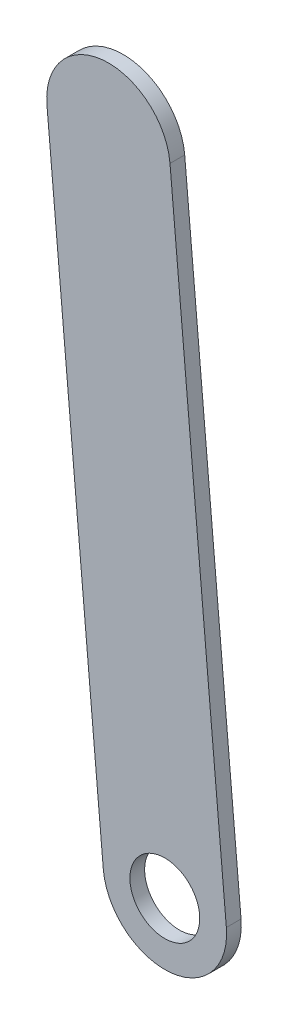
ISO-10303-21;
HEADER;
FILE_DESCRIPTION(('STEP AP214'),'2;1');
FILE_NAME('part.step','',(''),(''),'','','');
FILE_SCHEMA(('AUTOMOTIVE_DESIGN { 1 0 10303 214 1 1 1 1 }'));
ENDSEC;
DATA;
#1=APPLICATION_CONTEXT('core data for automotive mechanical design processes');
#2=APPLICATION_PROTOCOL_DEFINITION('international standard','automotive_design',2000,#1);
#3=PRODUCT_CONTEXT('',#1,'mechanical');
#4=PRODUCT('Part','Part','',(#3));
#5=PRODUCT_RELATED_PRODUCT_CATEGORY('part','',(#4));
#6=PRODUCT_DEFINITION_FORMATION('','',#4);
#7=PRODUCT_DEFINITION_CONTEXT('part definition',#1,'design');
#8=PRODUCT_DEFINITION('design','',#6,#7);
#9=PRODUCT_DEFINITION_SHAPE('','',#8);
#10=(LENGTH_UNIT() NAMED_UNIT(*) SI_UNIT(.MILLI.,.METRE.));
#11=(NAMED_UNIT(*) PLANE_ANGLE_UNIT() SI_UNIT($,.RADIAN.));
#12=(NAMED_UNIT(*) SI_UNIT($,.STERADIAN.) SOLID_ANGLE_UNIT());
#13=UNCERTAINTY_MEASURE_WITH_UNIT(LENGTH_MEASURE(1.E-05),#10,'distance_accuracy_value','');
#14=(GEOMETRIC_REPRESENTATION_CONTEXT(3) GLOBAL_UNCERTAINTY_ASSIGNED_CONTEXT((#13)) GLOBAL_UNIT_ASSIGNED_CONTEXT((#10,
#11,#12)) REPRESENTATION_CONTEXT('',''));
#15=CARTESIAN_POINT('',(0.,0.,0.));
#16=DIRECTION('',(0.,0.,1.));
#17=DIRECTION('',(1.,0.,0.));
#18=AXIS2_PLACEMENT_3D('',#15,#16,#17);
#19=CARTESIAN_POINT('',(27.6641887447392,19.341003872684,-0.837122603143399));
#20=DIRECTION('',(0.,0.,1.));
#21=DIRECTION('',(1.,0.,0.));
#22=AXIS2_PLACEMENT_3D('',#19,#20,#21);
#23=PLANE('',#22);
#24=DIRECTION('',(0.0885952767639579,-0.996067707003454,0.));
#25=VECTOR('',#24,1.);
#26=CARTESIAN_POINT('',(29.7893988044017,19.5300307551876,-0.837122603143395));
#27=LINE('',#26,#25);
#28=CARTESIAN_POINT('',(29.7893988044017,19.5300307551876,-0.837122603143395));
#29=VERTEX_POINT('',#28);
#30=CARTESIAN_POINT('',(31.7359256301827,-2.35457283538529,-0.837122603143405));
#31=VERTEX_POINT('',#30);
#32=EDGE_CURVE('E89',#29,#31,#27,.T.);
#33=ORIENTED_EDGE('',*,*,#32,.T.);
#34=CARTESIAN_POINT('',(29.6107155705201,-2.54359971788886,-0.837122603143419));
#35=DIRECTION('',(0.,0.,-1.));
#36=DIRECTION('',(-1.,0.,0.));
#37=AXIS2_PLACEMENT_3D('',#34,#35,#36);
#38=CIRCLE('',#37,2.1336);
#39=CARTESIAN_POINT('',(27.4855055108575,-2.73262660039245,-0.837122603143423));
#40=VERTEX_POINT('',#39);
#41=EDGE_CURVE('E76',#40,#31,#38,.F.);
#42=ORIENTED_EDGE('',*,*,#41,.F.);
#43=DIRECTION('',(-0.0885952767639579,0.996067707003454,0.));
#44=VECTOR('',#43,1.);
#45=CARTESIAN_POINT('',(25.5389786850766,19.1519769901805,-0.837122603143423));
#46=LINE('',#45,#44);
#47=CARTESIAN_POINT('',(25.5389786850766,19.1519769901804,-0.837122603143413));
#48=VERTEX_POINT('',#47);
#49=EDGE_CURVE('E74',#40,#48,#46,.T.);
#50=ORIENTED_EDGE('',*,*,#49,.T.);
#51=CARTESIAN_POINT('',(27.6641887447392,19.341003872684,-0.837122603143399));
#52=DIRECTION('',(0.,0.,-1.));
#53=DIRECTION('',(-1.,0.,0.));
#54=AXIS2_PLACEMENT_3D('',#51,#52,#53);
#55=CIRCLE('',#54,2.1336);
#56=EDGE_CURVE('E62',#29,#48,#55,.F.);
#57=ORIENTED_EDGE('',*,*,#56,.F.);
#58=EDGE_LOOP('',(#33,#42,#50,#57));
#59=FACE_BOUND('',#58,.T.);
#60=CARTESIAN_POINT('',(29.6107155705201,-2.54359971788886,-0.837122603143419));
#61=DIRECTION('',(0.,0.,-1.));
#62=DIRECTION('',(-1.,0.,0.));
#63=AXIS2_PLACEMENT_3D('',#60,#61,#62);
#64=CIRCLE('',#63,1.2065);
#65=CARTESIAN_POINT('',(28.4042155705201,-2.54359971788886,-0.837122603143421));
#66=VERTEX_POINT('',#65);
#67=EDGE_CURVE('E20',#66,#66,#64,.F.);
#68=ORIENTED_EDGE('',*,*,#67,.T.);
#69=EDGE_LOOP('',(#68));
#70=FACE_BOUND('',#69,.T.);
#71=ADVANCED_FACE('F17',(#59,#70),#23,.F.);
#72=CARTESIAN_POINT('',(29.6107155705201,-2.54359971788886,-0.329122603143419));
#73=DIRECTION('',(0.,0.,-1.));
#74=DIRECTION('',(-1.,0.,0.));
#75=AXIS2_PLACEMENT_3D('',#72,#73,#74);
#76=CYLINDRICAL_SURFACE('',#75,1.2065);
#77=CARTESIAN_POINT('',(29.6107155705201,-2.54359971788886,-0.329122603143419));
#78=DIRECTION('',(0.,0.,-1.));
#79=DIRECTION('',(-1.,0.,0.));
#80=AXIS2_PLACEMENT_3D('',#77,#78,#79);
#81=CIRCLE('',#80,1.2065);
#82=CARTESIAN_POINT('',(28.4042155705201,-2.54359971788886,-0.329122603143421));
#83=VERTEX_POINT('',#82);
#84=EDGE_CURVE('E91',#83,#83,#81,.T.);
#85=ORIENTED_EDGE('',*,*,#84,.F.);
#86=EDGE_LOOP('',(#85));
#87=FACE_BOUND('',#86,.T.);
#88=ORIENTED_EDGE('',*,*,#67,.F.);
#89=EDGE_LOOP('',(#88));
#90=FACE_BOUND('',#89,.T.);
#91=ADVANCED_FACE('F127',(#87,#90),#76,.F.);
#92=CARTESIAN_POINT('',(27.6641887447392,19.341003872684,-0.329122603143399));
#93=DIRECTION('',(0.,0.,-1.));
#94=DIRECTION('',(-1.,0.,0.));
#95=AXIS2_PLACEMENT_3D('',#92,#93,#94);
#96=CYLINDRICAL_SURFACE('',#95,2.1336);
#97=ORIENTED_EDGE('',*,*,#56,.T.);
#98=DIRECTION('',(0.,0.,1.));
#99=VECTOR('',#98,1.);
#100=CARTESIAN_POINT('',(25.5389786850766,19.1519769901805,-0.329122603143403));
#101=LINE('',#100,#99);
#102=CARTESIAN_POINT('',(25.5389786850766,19.1519769901804,-0.329122603143403));
#103=VERTEX_POINT('',#102);
#104=EDGE_CURVE('E66',#48,#103,#101,.T.);
#105=ORIENTED_EDGE('',*,*,#104,.T.);
#106=CARTESIAN_POINT('',(27.6641887447392,19.341003872684,-0.329122603143399));
#107=DIRECTION('',(0.,0.,-1.));
#108=DIRECTION('',(-1.,0.,0.));
#109=AXIS2_PLACEMENT_3D('',#106,#107,#108);
#110=CIRCLE('',#109,2.1336);
#111=CARTESIAN_POINT('',(29.7893988044017,19.5300307551876,-0.329122603143395));
#112=VERTEX_POINT('',#111);
#113=EDGE_CURVE('E96',#112,#103,#110,.F.);
#114=ORIENTED_EDGE('',*,*,#113,.F.);
#115=DIRECTION('',(0.,0.,1.));
#116=VECTOR('',#115,1.);
#117=CARTESIAN_POINT('',(29.7893988044017,19.5300307551876,-0.329122603143395));
#118=LINE('',#117,#116);
#119=EDGE_CURVE('E69',#112,#29,#118,.F.);
#120=ORIENTED_EDGE('',*,*,#119,.T.);
#121=EDGE_LOOP('',(#97,#105,#114,#120));
#122=FACE_BOUND('',#121,.T.);
#123=ADVANCED_FACE('F64',(#122),#96,.T.);
#124=CARTESIAN_POINT('',(25.5389786850766,19.1519769901805,-0.329122603143403));
#125=DIRECTION('',(0.996067707003454,0.0885952767639579,0.));
#126=DIRECTION('',(-0.0885952767639579,0.996067707003454,0.));
#127=AXIS2_PLACEMENT_3D('',#124,#125,#126);
#128=PLANE('',#127);
#129=DIRECTION('',(0.,0.,-1.));
#130=VECTOR('',#129,1.);
#131=CARTESIAN_POINT('',(27.4855055108575,-2.73262660039244,-0.329122603143423));
#132=LINE('',#131,#130);
#133=CARTESIAN_POINT('',(27.4855055108575,-2.73262660039245,-0.329122603143423));
#134=VERTEX_POINT('',#133);
#135=EDGE_CURVE('E87',#134,#40,#132,.T.);
#136=ORIENTED_EDGE('',*,*,#135,.F.);
#137=DIRECTION('',(0.0885952767639569,-0.996067707003453,0.));
#138=VECTOR('',#137,1.);
#139=CARTESIAN_POINT('',(25.5389786850766,19.1519769901805,-0.329122603143403));
#140=LINE('',#139,#138);
#141=EDGE_CURVE('E83',#103,#134,#140,.T.);
#142=ORIENTED_EDGE('',*,*,#141,.F.);
#143=ORIENTED_EDGE('',*,*,#104,.F.);
#144=ORIENTED_EDGE('',*,*,#49,.F.);
#145=EDGE_LOOP('',(#136,#142,#143,#144));
#146=FACE_BOUND('',#145,.T.);
#147=ADVANCED_FACE('F81',(#146),#128,.F.);
#148=CARTESIAN_POINT('',(29.6107155705201,-2.54359971788886,-0.329122603143419));
#149=DIRECTION('',(0.,0.,-1.));
#150=DIRECTION('',(-1.,0.,0.));
#151=AXIS2_PLACEMENT_3D('',#148,#149,#150);
#152=CYLINDRICAL_SURFACE('',#151,2.1336);
#153=CARTESIAN_POINT('',(29.6107155705201,-2.54359971788886,-0.329122603143419));
#154=DIRECTION('',(0.,0.,-1.));
#155=DIRECTION('',(-1.,0.,0.));
#156=AXIS2_PLACEMENT_3D('',#153,#154,#155);
#157=CIRCLE('',#156,2.1336);
#158=CARTESIAN_POINT('',(31.7359256301827,-2.35457283538529,-0.329122603143415));
#159=VERTEX_POINT('',#158);
#160=EDGE_CURVE('E27',#134,#159,#157,.F.);
#161=ORIENTED_EDGE('',*,*,#160,.F.);
#162=ORIENTED_EDGE('',*,*,#135,.T.);
#163=ORIENTED_EDGE('',*,*,#41,.T.);
#164=DIRECTION('',(0.,0.,1.));
#165=VECTOR('',#164,1.);
#166=CARTESIAN_POINT('',(31.7359256301827,-2.35457283538529,-0.329122603143395));
#167=LINE('',#166,#165);
#168=EDGE_CURVE('E40',#31,#159,#167,.T.);
#169=ORIENTED_EDGE('',*,*,#168,.T.);
#170=EDGE_LOOP('',(#161,#162,#163,#169));
#171=FACE_BOUND('',#170,.T.);
#172=ADVANCED_FACE('F114',(#171),#152,.T.);
#173=CARTESIAN_POINT('',(29.7893988044017,19.5300307551876,-0.329122603143395));
#174=DIRECTION('',(-0.996067707003454,-0.0885952767639579,0.));
#175=DIRECTION('',(0.0885952767639579,-0.996067707003454,0.));
#176=AXIS2_PLACEMENT_3D('',#173,#174,#175);
#177=PLANE('',#176);
#178=ORIENTED_EDGE('',*,*,#119,.F.);
#179=DIRECTION('',(-0.0885952767639569,0.996067707003453,0.));
#180=VECTOR('',#179,1.);
#181=CARTESIAN_POINT('',(31.7359256301826,-2.35457283538529,-0.329122603143415));
#182=LINE('',#181,#180);
#183=EDGE_CURVE('E11',#159,#112,#182,.T.);
#184=ORIENTED_EDGE('',*,*,#183,.F.);
#185=ORIENTED_EDGE('',*,*,#168,.F.);
#186=ORIENTED_EDGE('',*,*,#32,.F.);
#187=EDGE_LOOP('',(#178,#184,#185,#186));
#188=FACE_BOUND('',#187,.T.);
#189=ADVANCED_FACE('F112',(#188),#177,.F.);
#190=CARTESIAN_POINT('',(27.6641887447392,19.341003872684,-0.329122603143399));
#191=DIRECTION('',(0.,0.,1.));
#192=DIRECTION('',(1.,0.,0.));
#193=AXIS2_PLACEMENT_3D('',#190,#191,#192);
#194=PLANE('',#193);
#195=ORIENTED_EDGE('',*,*,#160,.T.);
#196=ORIENTED_EDGE('',*,*,#183,.T.);
#197=ORIENTED_EDGE('',*,*,#113,.T.);
#198=ORIENTED_EDGE('',*,*,#141,.T.);
#199=EDGE_LOOP('',(#195,#196,#197,#198));
#200=FACE_BOUND('',#199,.T.);
#201=ORIENTED_EDGE('',*,*,#84,.T.);
#202=EDGE_LOOP('',(#201));
#203=FACE_BOUND('',#202,.T.);
#204=ADVANCED_FACE('F109',(#200,#203),#194,.T.);
#205=CLOSED_SHELL('',(#71,#91,#123,#147,#172,#189,#204));
#206=MANIFOLD_SOLID_BREP('B1',#205);
#207=ADVANCED_BREP_SHAPE_REPRESENTATION('',(#18,#206),#14);
#208=SHAPE_DEFINITION_REPRESENTATION(#9,#207);
ENDSEC;
END-ISO-10303-21;
